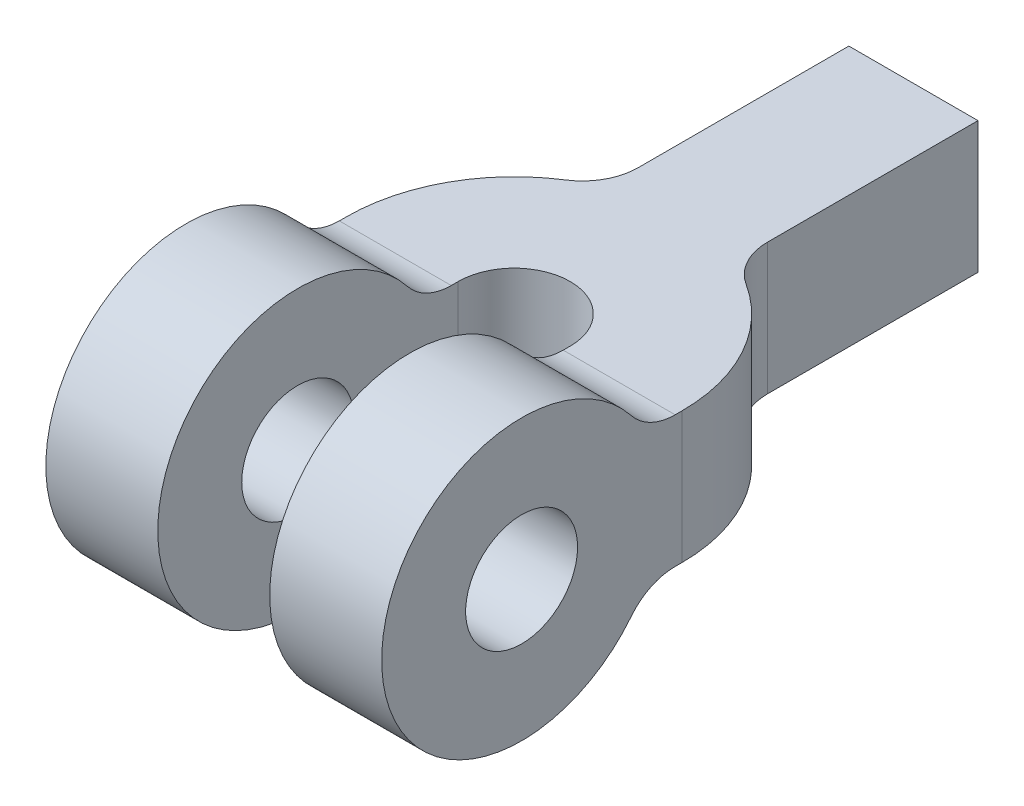
ISO-10303-21;
HEADER;
FILE_DESCRIPTION(('STEP AP214'),'2;1');
FILE_NAME('part.step','',(''),(''),'','','');
FILE_SCHEMA(('AUTOMOTIVE_DESIGN { 1 0 10303 214 1 1 1 1 }'));
ENDSEC;
DATA;
#1=APPLICATION_CONTEXT('core data for automotive mechanical design processes');
#2=APPLICATION_PROTOCOL_DEFINITION('international standard','automotive_design',2000,#1);
#3=PRODUCT_CONTEXT('',#1,'mechanical');
#4=PRODUCT('Part','Part','',(#3));
#5=PRODUCT_RELATED_PRODUCT_CATEGORY('part','',(#4));
#6=PRODUCT_DEFINITION_FORMATION('','',#4);
#7=PRODUCT_DEFINITION_CONTEXT('part definition',#1,'design');
#8=PRODUCT_DEFINITION('design','',#6,#7);
#9=PRODUCT_DEFINITION_SHAPE('','',#8);
#10=(LENGTH_UNIT() NAMED_UNIT(*) SI_UNIT(.MILLI.,.METRE.));
#11=(NAMED_UNIT(*) PLANE_ANGLE_UNIT() SI_UNIT($,.RADIAN.));
#12=(NAMED_UNIT(*) SI_UNIT($,.STERADIAN.) SOLID_ANGLE_UNIT());
#13=UNCERTAINTY_MEASURE_WITH_UNIT(LENGTH_MEASURE(1.E-05),#10,'distance_accuracy_value','');
#14=(GEOMETRIC_REPRESENTATION_CONTEXT(3) GLOBAL_UNCERTAINTY_ASSIGNED_CONTEXT((#13)) GLOBAL_UNIT_ASSIGNED_CONTEXT((#10,
#11,#12)) REPRESENTATION_CONTEXT('',''));
#15=CARTESIAN_POINT('',(0.,0.,0.));
#16=DIRECTION('',(0.,0.,1.));
#17=DIRECTION('',(1.,0.,0.));
#18=AXIS2_PLACEMENT_3D('',#15,#16,#17);
#19=CARTESIAN_POINT('',(-60.,100.,125.));
#20=DIRECTION('',(1.,0.,0.));
#21=DIRECTION('',(0.,0.,-1.));
#22=AXIS2_PLACEMENT_3D('',#19,#20,#21);
#23=PLANE('',#22);
#24=CARTESIAN_POINT('',(-60.,50.,75.));
#25=DIRECTION('',(1.,0.,0.));
#26=DIRECTION('',(0.,0.,-1.));
#27=AXIS2_PLACEMENT_3D('',#24,#25,#26);
#28=CIRCLE('',#27,20.);
#29=CARTESIAN_POINT('',(-60.,50.,55.));
#30=VERTEX_POINT('',#29);
#31=EDGE_CURVE('E289',#30,#30,#28,.T.);
#32=ORIENTED_EDGE('',*,*,#31,.T.);
#33=EDGE_LOOP('',(#32));
#34=FACE_BOUND('',#33,.T.);
#35=DIRECTION('',(0.,0.,-1.));
#36=VECTOR('',#35,1.);
#37=CARTESIAN_POINT('',(-60.,26.5250202616506,0.));
#38=LINE('',#37,#36);
#39=CARTESIAN_POINT('',(-60.,26.5250202616506,20.1372062618926));
#40=VERTEX_POINT('',#39);
#41=CARTESIAN_POINT('',(-60.,26.5250202616506,17.6446099189697));
#42=VERTEX_POINT('',#41);
#43=EDGE_CURVE('E193',#40,#42,#38,.T.);
#44=ORIENTED_EDGE('',*,*,#43,.F.);
#45=CARTESIAN_POINT('',(-60.,6.52502026165062,20.1372062618926));
#46=DIRECTION('',(1.,0.,0.));
#47=DIRECTION('',(0.,0.,-1.));
#48=AXIS2_PLACEMENT_3D('',#45,#46,#47);
#49=CIRCLE('',#48,20.);
#50=CARTESIAN_POINT('',(-60.,18.9464430440362,35.8122901870662));
#51=VERTEX_POINT('',#50);
#52=EDGE_CURVE('E203',#40,#51,#49,.T.);
#53=ORIENTED_EDGE('',*,*,#52,.T.);
#54=CARTESIAN_POINT('',(-60.,50.,75.));
#55=DIRECTION('',(1.,0.,0.));
#56=DIRECTION('',(0.,0.,-1.));
#57=AXIS2_PLACEMENT_3D('',#54,#55,#56);
#58=CIRCLE('',#57,50.);
#59=CARTESIAN_POINT('',(-60.,81.0535569559638,35.8122901870662));
#60=VERTEX_POINT('',#59);
#61=EDGE_CURVE('E299',#60,#51,#58,.T.);
#62=ORIENTED_EDGE('',*,*,#61,.F.);
#63=CARTESIAN_POINT('',(-60.,93.4749797383494,20.1372062618926));
#64=DIRECTION('',(1.,0.,0.));
#65=DIRECTION('',(0.,0.,-1.));
#66=AXIS2_PLACEMENT_3D('',#63,#64,#65);
#67=CIRCLE('',#66,20.);
#68=CARTESIAN_POINT('',(-60.,73.4749797383494,20.1372062618926));
#69=VERTEX_POINT('',#68);
#70=EDGE_CURVE('E226',#69,#60,#67,.F.);
#71=ORIENTED_EDGE('',*,*,#70,.F.);
#72=DIRECTION('',(0.,0.,-1.));
#73=VECTOR('',#72,1.);
#74=CARTESIAN_POINT('',(-60.,73.4749797383494,0.));
#75=LINE('',#74,#73);
#76=CARTESIAN_POINT('',(-60.,73.4749797383494,17.6446099189697));
#77=VERTEX_POINT('',#76);
#78=EDGE_CURVE('E229',#69,#77,#75,.T.);
#79=ORIENTED_EDGE('',*,*,#78,.T.);
#80=DIRECTION('',(0.,1.,0.));
#81=VECTOR('',#80,1.);
#82=CARTESIAN_POINT('',(-60.,0.,17.6446099189697));
#83=LINE('',#82,#81);
#84=EDGE_CURVE('E212',#42,#77,#83,.T.);
#85=ORIENTED_EDGE('',*,*,#84,.F.);
#86=EDGE_LOOP('',(#44,#53,#62,#71,#79,#85));
#87=FACE_BOUND('',#86,.T.);
#88=ADVANCED_FACE('F65',(#34,#87),#23,.F.);
#89=CARTESIAN_POINT('',(60.,100.,125.));
#90=DIRECTION('',(-1.,0.,0.));
#91=DIRECTION('',(0.,0.,1.));
#92=AXIS2_PLACEMENT_3D('',#89,#90,#91);
#93=PLANE('',#92);
#94=CARTESIAN_POINT('',(60.,50.,75.));
#95=DIRECTION('',(1.,0.,0.));
#96=DIRECTION('',(0.,0.,-1.));
#97=AXIS2_PLACEMENT_3D('',#94,#95,#96);
#98=CIRCLE('',#97,20.);
#99=CARTESIAN_POINT('',(60.,50.,55.));
#100=VERTEX_POINT('',#99);
#101=EDGE_CURVE('E288',#100,#100,#98,.T.);
#102=ORIENTED_EDGE('',*,*,#101,.F.);
#103=EDGE_LOOP('',(#102));
#104=FACE_BOUND('',#103,.T.);
#105=DIRECTION('',(0.,0.,-1.));
#106=VECTOR('',#105,1.);
#107=CARTESIAN_POINT('',(60.,26.5250202616506,0.));
#108=LINE('',#107,#106);
#109=CARTESIAN_POINT('',(60.,26.5250202616506,20.1372062618926));
#110=VERTEX_POINT('',#109);
#111=CARTESIAN_POINT('',(60.,26.5250202616506,17.6446099189697));
#112=VERTEX_POINT('',#111);
#113=EDGE_CURVE('E216',#110,#112,#108,.T.);
#114=ORIENTED_EDGE('',*,*,#113,.T.);
#115=DIRECTION('',(0.,1.,0.));
#116=VECTOR('',#115,1.);
#117=CARTESIAN_POINT('',(60.,0.,17.6446099189697));
#118=LINE('',#117,#116);
#119=CARTESIAN_POINT('',(60.,73.4749797383494,17.6446099189697));
#120=VERTEX_POINT('',#119);
#121=EDGE_CURVE('E317',#112,#120,#118,.T.);
#122=ORIENTED_EDGE('',*,*,#121,.T.);
#123=DIRECTION('',(0.,0.,-1.));
#124=VECTOR('',#123,1.);
#125=CARTESIAN_POINT('',(60.,73.4749797383494,0.));
#126=LINE('',#125,#124);
#127=CARTESIAN_POINT('',(60.,73.4749797383494,20.1372062618926));
#128=VERTEX_POINT('',#127);
#129=EDGE_CURVE('E230',#128,#120,#126,.T.);
#130=ORIENTED_EDGE('',*,*,#129,.F.);
#131=CARTESIAN_POINT('',(60.,93.4749797383494,20.1372062618926));
#132=DIRECTION('',(1.,0.,0.));
#133=DIRECTION('',(0.,0.,-1.));
#134=AXIS2_PLACEMENT_3D('',#131,#132,#133);
#135=CIRCLE('',#134,20.);
#136=CARTESIAN_POINT('',(60.,81.0535569559638,35.8122901870662));
#137=VERTEX_POINT('',#136);
#138=EDGE_CURVE('E233',#128,#137,#135,.F.);
#139=ORIENTED_EDGE('',*,*,#138,.T.);
#140=CARTESIAN_POINT('',(60.,50.,75.));
#141=DIRECTION('',(1.,0.,0.));
#142=DIRECTION('',(0.,0.,-1.));
#143=AXIS2_PLACEMENT_3D('',#140,#141,#142);
#144=CIRCLE('',#143,50.);
#145=CARTESIAN_POINT('',(60.,18.9464430440362,35.8122901870662));
#146=VERTEX_POINT('',#145);
#147=EDGE_CURVE('E298',#137,#146,#144,.T.);
#148=ORIENTED_EDGE('',*,*,#147,.T.);
#149=CARTESIAN_POINT('',(60.,6.52502026165062,20.1372062618926));
#150=DIRECTION('',(1.,0.,0.));
#151=DIRECTION('',(0.,0.,-1.));
#152=AXIS2_PLACEMENT_3D('',#149,#150,#151);
#153=CIRCLE('',#152,20.);
#154=EDGE_CURVE('E213',#110,#146,#153,.T.);
#155=ORIENTED_EDGE('',*,*,#154,.F.);
#156=EDGE_LOOP('',(#114,#122,#130,#139,#148,#155));
#157=FACE_BOUND('',#156,.T.);
#158=ADVANCED_FACE('F364',(#104,#157),#93,.F.);
#159=CARTESIAN_POINT('',(20.,0.,0.));
#160=DIRECTION('',(-1.,0.,0.));
#161=DIRECTION('',(0.,0.,1.));
#162=AXIS2_PLACEMENT_3D('',#159,#160,#161);
#163=PLANE('',#162);
#164=CARTESIAN_POINT('',(20.,50.,75.));
#165=DIRECTION('',(-1.,0.,0.));
#166=DIRECTION('',(0.,0.,1.));
#167=AXIS2_PLACEMENT_3D('',#164,#165,#166);
#168=CIRCLE('',#167,20.);
#169=CARTESIAN_POINT('',(20.,50.,95.));
#170=VERTEX_POINT('',#169);
#171=EDGE_CURVE('E295',#170,#170,#168,.T.);
#172=ORIENTED_EDGE('',*,*,#171,.F.);
#173=EDGE_LOOP('',(#172));
#174=FACE_BOUND('',#173,.T.);
#175=DIRECTION('',(0.,1.,0.));
#176=VECTOR('',#175,1.);
#177=CARTESIAN_POINT('',(20.,0.,17.6446099189697));
#178=LINE('',#177,#176);
#179=CARTESIAN_POINT('',(20.,26.5250202616506,17.6446099189697));
#180=VERTEX_POINT('',#179);
#181=CARTESIAN_POINT('',(20.,73.4749797383494,17.6446099189697));
#182=VERTEX_POINT('',#181);
#183=EDGE_CURVE('E326',#180,#182,#178,.T.);
#184=ORIENTED_EDGE('',*,*,#183,.F.);
#185=DIRECTION('',(0.,0.,1.));
#186=VECTOR('',#185,1.);
#187=CARTESIAN_POINT('',(20.,26.5250202616506,0.));
#188=LINE('',#187,#186);
#189=CARTESIAN_POINT('',(20.,26.5250202616506,20.1372062618926));
#190=VERTEX_POINT('',#189);
#191=EDGE_CURVE('E280',#180,#190,#188,.T.);
#192=ORIENTED_EDGE('',*,*,#191,.T.);
#193=CARTESIAN_POINT('',(20.,6.52502026165062,20.1372062618926));
#194=DIRECTION('',(-1.,0.,0.));
#195=DIRECTION('',(0.,0.,1.));
#196=AXIS2_PLACEMENT_3D('',#193,#194,#195);
#197=CIRCLE('',#196,20.);
#198=CARTESIAN_POINT('',(20.,18.9464430440362,35.8122901870662));
#199=VERTEX_POINT('',#198);
#200=EDGE_CURVE('E286',#199,#190,#197,.T.);
#201=ORIENTED_EDGE('',*,*,#200,.F.);
#202=CARTESIAN_POINT('',(20.,50.,75.));
#203=DIRECTION('',(-1.,0.,0.));
#204=DIRECTION('',(0.,0.,1.));
#205=AXIS2_PLACEMENT_3D('',#202,#203,#204);
#206=CIRCLE('',#205,50.);
#207=CARTESIAN_POINT('',(20.,81.0535569559638,35.8122901870662));
#208=VERTEX_POINT('',#207);
#209=EDGE_CURVE('E79',#199,#208,#206,.T.);
#210=ORIENTED_EDGE('',*,*,#209,.T.);
#211=CARTESIAN_POINT('',(20.,93.4749797383494,20.1372062618926));
#212=DIRECTION('',(-1.,0.,0.));
#213=DIRECTION('',(0.,0.,1.));
#214=AXIS2_PLACEMENT_3D('',#211,#212,#213);
#215=CIRCLE('',#214,20.);
#216=CARTESIAN_POINT('',(20.,73.4749797383494,20.1372062618926));
#217=VERTEX_POINT('',#216);
#218=EDGE_CURVE('E283',#208,#217,#215,.F.);
#219=ORIENTED_EDGE('',*,*,#218,.T.);
#220=DIRECTION('',(0.,0.,1.));
#221=VECTOR('',#220,1.);
#222=CARTESIAN_POINT('',(20.,73.4749797383494,0.));
#223=LINE('',#222,#221);
#224=EDGE_CURVE('E263',#182,#217,#223,.T.);
#225=ORIENTED_EDGE('',*,*,#224,.F.);
#226=EDGE_LOOP('',(#184,#192,#201,#210,#219,#225));
#227=FACE_BOUND('',#226,.T.);
#228=ADVANCED_FACE('F354',(#174,#227),#163,.T.);
#229=CARTESIAN_POINT('',(-20.,0.,0.));
#230=DIRECTION('',(-1.,0.,0.));
#231=DIRECTION('',(0.,0.,1.));
#232=AXIS2_PLACEMENT_3D('',#229,#230,#231);
#233=PLANE('',#232);
#234=CARTESIAN_POINT('',(-20.,50.,75.));
#235=DIRECTION('',(-1.,0.,0.));
#236=DIRECTION('',(0.,0.,1.));
#237=AXIS2_PLACEMENT_3D('',#234,#235,#236);
#238=CIRCLE('',#237,20.);
#239=CARTESIAN_POINT('',(-20.,50.,95.));
#240=VERTEX_POINT('',#239);
#241=EDGE_CURVE('E292',#240,#240,#238,.T.);
#242=ORIENTED_EDGE('',*,*,#241,.T.);
#243=EDGE_LOOP('',(#242));
#244=FACE_BOUND('',#243,.T.);
#245=DIRECTION('',(0.,0.,1.));
#246=VECTOR('',#245,1.);
#247=CARTESIAN_POINT('',(-20.,26.5250202616506,0.));
#248=LINE('',#247,#246);
#249=CARTESIAN_POINT('',(-20.,26.5250202616506,17.6446099189697));
#250=VERTEX_POINT('',#249);
#251=CARTESIAN_POINT('',(-20.,26.5250202616506,20.1372062618926));
#252=VERTEX_POINT('',#251);
#253=EDGE_CURVE('E196',#250,#252,#248,.T.);
#254=ORIENTED_EDGE('',*,*,#253,.F.);
#255=DIRECTION('',(0.,1.,0.));
#256=VECTOR('',#255,1.);
#257=CARTESIAN_POINT('',(-20.,0.,17.6446099189697));
#258=LINE('',#257,#256);
#259=CARTESIAN_POINT('',(-20.,73.4749797383494,17.6446099189697));
#260=VERTEX_POINT('',#259);
#261=EDGE_CURVE('E303',#250,#260,#258,.T.);
#262=ORIENTED_EDGE('',*,*,#261,.T.);
#263=DIRECTION('',(0.,0.,1.));
#264=VECTOR('',#263,1.);
#265=CARTESIAN_POINT('',(-20.,73.4749797383494,0.));
#266=LINE('',#265,#264);
#267=CARTESIAN_POINT('',(-20.,73.4749797383494,20.1372062618926));
#268=VERTEX_POINT('',#267);
#269=EDGE_CURVE('E260',#260,#268,#266,.T.);
#270=ORIENTED_EDGE('',*,*,#269,.T.);
#271=CARTESIAN_POINT('',(-20.,93.4749797383494,20.1372062618926));
#272=DIRECTION('',(-1.,0.,0.));
#273=DIRECTION('',(0.,0.,1.));
#274=AXIS2_PLACEMENT_3D('',#271,#272,#273);
#275=CIRCLE('',#274,20.);
#276=CARTESIAN_POINT('',(-20.,81.0535569559638,35.8122901870662));
#277=VERTEX_POINT('',#276);
#278=EDGE_CURVE('E72',#277,#268,#275,.F.);
#279=ORIENTED_EDGE('',*,*,#278,.F.);
#280=CARTESIAN_POINT('',(-20.,50.,75.));
#281=DIRECTION('',(-1.,0.,0.));
#282=DIRECTION('',(0.,0.,1.));
#283=AXIS2_PLACEMENT_3D('',#280,#281,#282);
#284=CIRCLE('',#283,50.);
#285=CARTESIAN_POINT('',(-20.,18.9464430440362,35.8122901870662));
#286=VERTEX_POINT('',#285);
#287=EDGE_CURVE('E86',#286,#277,#284,.T.);
#288=ORIENTED_EDGE('',*,*,#287,.F.);
#289=CARTESIAN_POINT('',(-20.,6.52502026165062,20.1372062618926));
#290=DIRECTION('',(-1.,0.,0.));
#291=DIRECTION('',(0.,0.,1.));
#292=AXIS2_PLACEMENT_3D('',#289,#290,#291);
#293=CIRCLE('',#292,20.);
#294=EDGE_CURVE('E12',#286,#252,#293,.T.);
#295=ORIENTED_EDGE('',*,*,#294,.T.);
#296=EDGE_LOOP('',(#254,#262,#270,#279,#288,#295));
#297=FACE_BOUND('',#296,.T.);
#298=ADVANCED_FACE('F345',(#244,#297),#233,.F.);
#299=CARTESIAN_POINT('',(60.,100.,-125.));
#300=DIRECTION('',(0.,0.,1.));
#301=DIRECTION('',(1.,0.,0.));
#302=AXIS2_PLACEMENT_3D('',#299,#300,#301);
#303=PLANE('',#302);
#304=DIRECTION('',(1.,0.,0.));
#305=VECTOR('',#304,1.);
#306=CARTESIAN_POINT('',(-60.,26.5250202616506,-125.));
#307=LINE('',#306,#305);
#308=CARTESIAN_POINT('',(-23.0717096546584,26.5250202616506,-125.));
#309=VERTEX_POINT('',#308);
#310=CARTESIAN_POINT('',(23.0717096546584,26.5250202616506,-125.));
#311=VERTEX_POINT('',#310);
#312=EDGE_CURVE('E222',#309,#311,#307,.T.);
#313=ORIENTED_EDGE('',*,*,#312,.F.);
#314=DIRECTION('',(0.,1.,0.));
#315=VECTOR('',#314,1.);
#316=CARTESIAN_POINT('',(-23.0717096546584,0.,-125.));
#317=LINE('',#316,#315);
#318=CARTESIAN_POINT('',(-23.0717096546584,73.4749797383494,-125.));
#319=VERTEX_POINT('',#318);
#320=EDGE_CURVE('E305',#309,#319,#317,.T.);
#321=ORIENTED_EDGE('',*,*,#320,.T.);
#322=DIRECTION('',(1.,0.,0.));
#323=VECTOR('',#322,1.);
#324=CARTESIAN_POINT('',(-60.,73.4749797383494,-125.));
#325=LINE('',#324,#323);
#326=CARTESIAN_POINT('',(23.0717096546584,73.4749797383494,-125.));
#327=VERTEX_POINT('',#326);
#328=EDGE_CURVE('E240',#319,#327,#325,.T.);
#329=ORIENTED_EDGE('',*,*,#328,.T.);
#330=DIRECTION('',(0.,1.,0.));
#331=VECTOR('',#330,1.);
#332=CARTESIAN_POINT('',(23.0717096546584,0.,-125.));
#333=LINE('',#332,#331);
#334=EDGE_CURVE('E314',#311,#327,#333,.T.);
#335=ORIENTED_EDGE('',*,*,#334,.F.);
#336=EDGE_LOOP('',(#313,#321,#329,#335));
#337=FACE_BOUND('',#336,.T.);
#338=ADVANCED_FACE('F381',(#337),#303,.F.);
#339=CARTESIAN_POINT('',(0.,0.,17.6446099189697));
#340=DIRECTION('',(0.,1.,0.));
#341=DIRECTION('',(0.,0.,1.));
#342=AXIS2_PLACEMENT_3D('',#339,#340,#341);
#343=CYLINDRICAL_SURFACE('',#342,20.);
#344=CARTESIAN_POINT('',(0.,26.5250202616506,17.6446099189697));
#345=DIRECTION('',(0.,-1.,0.));
#346=DIRECTION('',(0.,0.,-1.));
#347=AXIS2_PLACEMENT_3D('',#344,#345,#346);
#348=CIRCLE('',#347,20.);
#349=EDGE_CURVE('E277',#180,#250,#348,.F.);
#350=ORIENTED_EDGE('',*,*,#349,.F.);
#351=ORIENTED_EDGE('',*,*,#183,.T.);
#352=CARTESIAN_POINT('',(0.,73.4749797383494,17.6446099189697));
#353=DIRECTION('',(0.,-1.,0.));
#354=DIRECTION('',(0.,0.,-1.));
#355=AXIS2_PLACEMENT_3D('',#352,#353,#354);
#356=CIRCLE('',#355,20.);
#357=EDGE_CURVE('E257',#182,#260,#356,.F.);
#358=ORIENTED_EDGE('',*,*,#357,.T.);
#359=ORIENTED_EDGE('',*,*,#261,.F.);
#360=EDGE_LOOP('',(#350,#351,#358,#359));
#361=FACE_BOUND('',#360,.T.);
#362=ADVANCED_FACE('F349',(#361),#343,.F.);
#363=CARTESIAN_POINT('',(23.0717096546585,0.,0.));
#364=DIRECTION('',(-1.,0.,0.));
#365=DIRECTION('',(0.,0.,1.));
#366=AXIS2_PLACEMENT_3D('',#363,#364,#365);
#367=PLANE('',#366);
#368=DIRECTION('',(0.,0.,1.));
#369=VECTOR('',#368,1.);
#370=CARTESIAN_POINT('',(23.0717096546585,26.5250202616506,0.));
#371=LINE('',#370,#369);
#372=CARTESIAN_POINT('',(23.0717096546585,26.5250202616506,-49.7707283018298));
#373=VERTEX_POINT('',#372);
#374=EDGE_CURVE('E275',#311,#373,#371,.T.);
#375=ORIENTED_EDGE('',*,*,#374,.F.);
#376=ORIENTED_EDGE('',*,*,#334,.T.);
#377=DIRECTION('',(0.,0.,1.));
#378=VECTOR('',#377,1.);
#379=CARTESIAN_POINT('',(23.0717096546585,73.4749797383494,0.));
#380=LINE('',#379,#378);
#381=CARTESIAN_POINT('',(23.0717096546585,73.4749797383494,-49.7707283018298));
#382=VERTEX_POINT('',#381);
#383=EDGE_CURVE('E254',#327,#382,#380,.T.);
#384=ORIENTED_EDGE('',*,*,#383,.T.);
#385=DIRECTION('',(0.,1.,0.));
#386=VECTOR('',#385,1.);
#387=CARTESIAN_POINT('',(23.0717096546585,0.,-49.7707283018298));
#388=LINE('',#387,#386);
#389=EDGE_CURVE('E323',#373,#382,#388,.T.);
#390=ORIENTED_EDGE('',*,*,#389,.F.);
#391=EDGE_LOOP('',(#375,#376,#384,#390));
#392=FACE_BOUND('',#391,.T.);
#393=ADVANCED_FACE('F377',(#392),#367,.F.);
#394=CARTESIAN_POINT('',(0.,0.,17.6446099189697));
#395=DIRECTION('',(0.,1.,0.));
#396=DIRECTION('',(0.,0.,1.));
#397=AXIS2_PLACEMENT_3D('',#394,#395,#396);
#398=CYLINDRICAL_SURFACE('',#397,60.);
#399=ORIENTED_EDGE('',*,*,#121,.F.);
#400=CARTESIAN_POINT('',(0.,26.5250202616506,17.6446099189697));
#401=DIRECTION('',(0.,-1.,0.));
#402=DIRECTION('',(0.,0.,-1.));
#403=AXIS2_PLACEMENT_3D('',#400,#401,#402);
#404=CIRCLE('',#403,60.);
#405=CARTESIAN_POINT('',(32.3037822409938,26.5250202616506,-32.9168937466299));
#406=VERTEX_POINT('',#405);
#407=EDGE_CURVE('E272',#112,#406,#404,.F.);
#408=ORIENTED_EDGE('',*,*,#407,.T.);
#409=DIRECTION('',(0.,1.,0.));
#410=VECTOR('',#409,1.);
#411=CARTESIAN_POINT('',(32.3037822409938,0.,-32.9168937466299));
#412=LINE('',#411,#410);
#413=CARTESIAN_POINT('',(32.3037822409938,73.4749797383494,-32.9168937466299));
#414=VERTEX_POINT('',#413);
#415=EDGE_CURVE('E320',#406,#414,#412,.T.);
#416=ORIENTED_EDGE('',*,*,#415,.T.);
#417=CARTESIAN_POINT('',(0.,73.4749797383494,17.6446099189697));
#418=DIRECTION('',(0.,-1.,0.));
#419=DIRECTION('',(0.,0.,-1.));
#420=AXIS2_PLACEMENT_3D('',#417,#418,#419);
#421=CIRCLE('',#420,60.);
#422=EDGE_CURVE('E252',#120,#414,#421,.F.);
#423=ORIENTED_EDGE('',*,*,#422,.F.);
#424=EDGE_LOOP('',(#399,#408,#416,#423));
#425=FACE_BOUND('',#424,.T.);
#426=ADVANCED_FACE('F369',(#425),#398,.T.);
#427=CARTESIAN_POINT('',(43.0717096546584,0.,-49.7707283018298));
#428=DIRECTION('',(0.,1.,0.));
#429=DIRECTION('',(0.,0.,1.));
#430=AXIS2_PLACEMENT_3D('',#427,#428,#429);
#431=CYLINDRICAL_SURFACE('',#430,20.);
#432=CARTESIAN_POINT('',(43.0717096546584,26.5250202616506,-49.7707283018298));
#433=DIRECTION('',(0.,-1.,0.));
#434=DIRECTION('',(0.,0.,-1.));
#435=AXIS2_PLACEMENT_3D('',#432,#433,#434);
#436=CIRCLE('',#435,20.);
#437=EDGE_CURVE('E270',#373,#406,#436,.F.);
#438=ORIENTED_EDGE('',*,*,#437,.F.);
#439=ORIENTED_EDGE('',*,*,#389,.T.);
#440=CARTESIAN_POINT('',(43.0717096546584,73.4749797383494,-49.7707283018298));
#441=DIRECTION('',(0.,-1.,0.));
#442=DIRECTION('',(0.,0.,-1.));
#443=AXIS2_PLACEMENT_3D('',#440,#441,#442);
#444=CIRCLE('',#443,20.);
#445=EDGE_CURVE('E249',#382,#414,#444,.F.);
#446=ORIENTED_EDGE('',*,*,#445,.T.);
#447=ORIENTED_EDGE('',*,*,#415,.F.);
#448=EDGE_LOOP('',(#438,#439,#446,#447));
#449=FACE_BOUND('',#448,.T.);
#450=ADVANCED_FACE('F373',(#449),#431,.F.);
#451=CARTESIAN_POINT('',(0.,0.,17.6446099189697));
#452=DIRECTION('',(0.,1.,0.));
#453=DIRECTION('',(0.,0.,1.));
#454=AXIS2_PLACEMENT_3D('',#451,#452,#453);
#455=CYLINDRICAL_SURFACE('',#454,60.);
#456=DIRECTION('',(0.,1.,0.));
#457=VECTOR('',#456,1.);
#458=CARTESIAN_POINT('',(-32.3037822409938,0.,-32.9168937466299));
#459=LINE('',#458,#457);
#460=CARTESIAN_POINT('',(-32.3037822409938,26.5250202616506,-32.9168937466299));
#461=VERTEX_POINT('',#460);
#462=CARTESIAN_POINT('',(-32.3037822409938,73.4749797383494,-32.9168937466299));
#463=VERTEX_POINT('',#462);
#464=EDGE_CURVE('E311',#461,#463,#459,.T.);
#465=ORIENTED_EDGE('',*,*,#464,.F.);
#466=CARTESIAN_POINT('',(0.,26.5250202616506,17.6446099189697));
#467=DIRECTION('',(0.,-1.,0.));
#468=DIRECTION('',(0.,0.,-1.));
#469=AXIS2_PLACEMENT_3D('',#466,#467,#468);
#470=CIRCLE('',#469,60.);
#471=EDGE_CURVE('E268',#461,#42,#470,.F.);
#472=ORIENTED_EDGE('',*,*,#471,.T.);
#473=ORIENTED_EDGE('',*,*,#84,.T.);
#474=CARTESIAN_POINT('',(0.,73.4749797383494,17.6446099189697));
#475=DIRECTION('',(0.,-1.,0.));
#476=DIRECTION('',(0.,0.,-1.));
#477=AXIS2_PLACEMENT_3D('',#474,#475,#476);
#478=CIRCLE('',#477,60.);
#479=EDGE_CURVE('E247',#463,#77,#478,.F.);
#480=ORIENTED_EDGE('',*,*,#479,.F.);
#481=EDGE_LOOP('',(#465,#472,#473,#480));
#482=FACE_BOUND('',#481,.T.);
#483=ADVANCED_FACE('F393',(#482),#455,.T.);
#484=CARTESIAN_POINT('',(-23.0717096546584,0.,0.));
#485=DIRECTION('',(-1.,0.,0.));
#486=DIRECTION('',(0.,0.,1.));
#487=AXIS2_PLACEMENT_3D('',#484,#485,#486);
#488=PLANE('',#487);
#489=ORIENTED_EDGE('',*,*,#320,.F.);
#490=DIRECTION('',(0.,0.,1.));
#491=VECTOR('',#490,1.);
#492=CARTESIAN_POINT('',(-23.0717096546584,26.5250202616506,0.));
#493=LINE('',#492,#491);
#494=CARTESIAN_POINT('',(-23.0717096546584,26.5250202616506,-49.7707283018298));
#495=VERTEX_POINT('',#494);
#496=EDGE_CURVE('E265',#309,#495,#493,.T.);
#497=ORIENTED_EDGE('',*,*,#496,.T.);
#498=DIRECTION('',(0.,1.,0.));
#499=VECTOR('',#498,1.);
#500=CARTESIAN_POINT('',(-23.0717096546584,0.,-49.7707283018298));
#501=LINE('',#500,#499);
#502=CARTESIAN_POINT('',(-23.0717096546584,73.4749797383494,-49.7707283018298));
#503=VERTEX_POINT('',#502);
#504=EDGE_CURVE('E308',#495,#503,#501,.T.);
#505=ORIENTED_EDGE('',*,*,#504,.T.);
#506=DIRECTION('',(0.,0.,1.));
#507=VECTOR('',#506,1.);
#508=CARTESIAN_POINT('',(-23.0717096546584,73.4749797383494,0.));
#509=LINE('',#508,#507);
#510=EDGE_CURVE('E224',#319,#503,#509,.T.);
#511=ORIENTED_EDGE('',*,*,#510,.F.);
#512=EDGE_LOOP('',(#489,#497,#505,#511));
#513=FACE_BOUND('',#512,.T.);
#514=ADVANCED_FACE('F385',(#513),#488,.T.);
#515=CARTESIAN_POINT('',(-43.0717096546584,0.,-49.7707283018298));
#516=DIRECTION('',(0.,1.,0.));
#517=DIRECTION('',(0.,0.,1.));
#518=AXIS2_PLACEMENT_3D('',#515,#516,#517);
#519=CYLINDRICAL_SURFACE('',#518,20.);
#520=CARTESIAN_POINT('',(-43.0717096546584,26.5250202616506,-49.7707283018298));
#521=DIRECTION('',(0.,-1.,0.));
#522=DIRECTION('',(0.,0.,-1.));
#523=AXIS2_PLACEMENT_3D('',#520,#521,#522);
#524=CIRCLE('',#523,20.);
#525=EDGE_CURVE('E337',#461,#495,#524,.F.);
#526=ORIENTED_EDGE('',*,*,#525,.F.);
#527=ORIENTED_EDGE('',*,*,#464,.T.);
#528=CARTESIAN_POINT('',(-43.0717096546584,73.4749797383494,-49.7707283018298));
#529=DIRECTION('',(0.,-1.,0.));
#530=DIRECTION('',(0.,0.,-1.));
#531=AXIS2_PLACEMENT_3D('',#528,#529,#530);
#532=CIRCLE('',#531,20.);
#533=EDGE_CURVE('E332',#463,#503,#532,.F.);
#534=ORIENTED_EDGE('',*,*,#533,.T.);
#535=ORIENTED_EDGE('',*,*,#504,.F.);
#536=EDGE_LOOP('',(#526,#527,#534,#535));
#537=FACE_BOUND('',#536,.T.);
#538=ADVANCED_FACE('F389',(#537),#519,.F.);
#539=CARTESIAN_POINT('',(-60.,50.,75.));
#540=DIRECTION('',(1.,0.,0.));
#541=DIRECTION('',(0.,0.,-1.));
#542=AXIS2_PLACEMENT_3D('',#539,#540,#541);
#543=CYLINDRICAL_SURFACE('',#542,50.);
#544=ORIENTED_EDGE('',*,*,#287,.T.);
#545=DIRECTION('',(1.,0.,0.));
#546=VECTOR('',#545,1.);
#547=CARTESIAN_POINT('',(-60.,81.0535569559638,35.8122901870662));
#548=LINE('',#547,#546);
#549=EDGE_CURVE('E220',#60,#277,#548,.T.);
#550=ORIENTED_EDGE('',*,*,#549,.F.);
#551=ORIENTED_EDGE('',*,*,#61,.T.);
#552=DIRECTION('',(1.,0.,0.));
#553=VECTOR('',#552,1.);
#554=CARTESIAN_POINT('',(-60.,18.9464430440362,35.8122901870662));
#555=LINE('',#554,#553);
#556=EDGE_CURVE('E206',#51,#286,#555,.T.);
#557=ORIENTED_EDGE('',*,*,#556,.T.);
#558=EDGE_LOOP('',(#544,#550,#551,#557));
#559=FACE_BOUND('',#558,.T.);
#560=ADVANCED_FACE('F446',(#559),#543,.T.);
#561=ORIENTED_EDGE('',*,*,#209,.F.);
#562=EDGE_CURVE('E198',#199,#146,#555,.T.);
#563=ORIENTED_EDGE('',*,*,#562,.T.);
#564=ORIENTED_EDGE('',*,*,#147,.F.);
#565=EDGE_CURVE('E239',#208,#137,#548,.T.);
#566=ORIENTED_EDGE('',*,*,#565,.F.);
#567=EDGE_LOOP('',(#561,#563,#564,#566));
#568=FACE_BOUND('',#567,.T.);
#569=ADVANCED_FACE('F361',(#568),#543,.T.);
#570=CARTESIAN_POINT('',(-60.,50.,75.));
#571=DIRECTION('',(1.,0.,0.));
#572=DIRECTION('',(0.,0.,-1.));
#573=AXIS2_PLACEMENT_3D('',#570,#571,#572);
#574=CYLINDRICAL_SURFACE('',#573,20.);
#575=ORIENTED_EDGE('',*,*,#31,.F.);
#576=EDGE_LOOP('',(#575));
#577=FACE_BOUND('',#576,.T.);
#578=ORIENTED_EDGE('',*,*,#241,.F.);
#579=EDGE_LOOP('',(#578));
#580=FACE_BOUND('',#579,.T.);
#581=ADVANCED_FACE('F413',(#577,#580),#574,.F.);
#582=ORIENTED_EDGE('',*,*,#171,.T.);
#583=EDGE_LOOP('',(#582));
#584=FACE_BOUND('',#583,.T.);
#585=ORIENTED_EDGE('',*,*,#101,.T.);
#586=EDGE_LOOP('',(#585));
#587=FACE_BOUND('',#586,.T.);
#588=ADVANCED_FACE('F416',(#584,#587),#574,.F.);
#589=CARTESIAN_POINT('',(-60.,93.4749797383494,20.1372062618926));
#590=DIRECTION('',(1.,0.,0.));
#591=DIRECTION('',(0.,0.,-1.));
#592=AXIS2_PLACEMENT_3D('',#589,#590,#591);
#593=CYLINDRICAL_SURFACE('',#592,20.);
#594=ORIENTED_EDGE('',*,*,#278,.T.);
#595=DIRECTION('',(1.,0.,0.));
#596=VECTOR('',#595,1.);
#597=CARTESIAN_POINT('',(-60.,73.4749797383494,20.1372062618926));
#598=LINE('',#597,#596);
#599=EDGE_CURVE('E243',#69,#268,#598,.T.);
#600=ORIENTED_EDGE('',*,*,#599,.F.);
#601=ORIENTED_EDGE('',*,*,#70,.T.);
#602=ORIENTED_EDGE('',*,*,#549,.T.);
#603=EDGE_LOOP('',(#594,#600,#601,#602));
#604=FACE_BOUND('',#603,.T.);
#605=ADVANCED_FACE('F339',(#604),#593,.F.);
#606=CARTESIAN_POINT('',(-60.,73.4749797383494,0.));
#607=DIRECTION('',(0.,-1.,0.));
#608=DIRECTION('',(0.,0.,-1.));
#609=AXIS2_PLACEMENT_3D('',#606,#607,#608);
#610=PLANE('',#609);
#611=ORIENTED_EDGE('',*,*,#224,.T.);
#612=EDGE_CURVE('E232',#217,#128,#598,.T.);
#613=ORIENTED_EDGE('',*,*,#612,.T.);
#614=ORIENTED_EDGE('',*,*,#129,.T.);
#615=ORIENTED_EDGE('',*,*,#422,.T.);
#616=ORIENTED_EDGE('',*,*,#445,.F.);
#617=ORIENTED_EDGE('',*,*,#383,.F.);
#618=ORIENTED_EDGE('',*,*,#328,.F.);
#619=ORIENTED_EDGE('',*,*,#510,.T.);
#620=ORIENTED_EDGE('',*,*,#533,.F.);
#621=ORIENTED_EDGE('',*,*,#479,.T.);
#622=ORIENTED_EDGE('',*,*,#78,.F.);
#623=ORIENTED_EDGE('',*,*,#599,.T.);
#624=ORIENTED_EDGE('',*,*,#269,.F.);
#625=ORIENTED_EDGE('',*,*,#357,.F.);
#626=EDGE_LOOP('',(#611,#613,#614,#615,#616,#617,#618,#619,#620,#621,#622,#623,#624,#625));
#627=FACE_BOUND('',#626,.T.);
#628=ADVANCED_FACE('F343',(#627),#610,.F.);
#629=ORIENTED_EDGE('',*,*,#565,.T.);
#630=ORIENTED_EDGE('',*,*,#138,.F.);
#631=ORIENTED_EDGE('',*,*,#612,.F.);
#632=ORIENTED_EDGE('',*,*,#218,.F.);
#633=EDGE_LOOP('',(#629,#630,#631,#632));
#634=FACE_BOUND('',#633,.T.);
#635=ADVANCED_FACE('F359',(#634),#593,.F.);
#636=CARTESIAN_POINT('',(-60.,6.52502026165062,20.1372062618926));
#637=DIRECTION('',(1.,0.,0.));
#638=DIRECTION('',(0.,0.,-1.));
#639=AXIS2_PLACEMENT_3D('',#636,#637,#638);
#640=CYLINDRICAL_SURFACE('',#639,20.);
#641=ORIENTED_EDGE('',*,*,#556,.F.);
#642=ORIENTED_EDGE('',*,*,#52,.F.);
#643=DIRECTION('',(1.,0.,0.));
#644=VECTOR('',#643,1.);
#645=CARTESIAN_POINT('',(-60.,26.5250202616506,20.1372062618926));
#646=LINE('',#645,#644);
#647=EDGE_CURVE('E189',#40,#252,#646,.T.);
#648=ORIENTED_EDGE('',*,*,#647,.T.);
#649=ORIENTED_EDGE('',*,*,#294,.F.);
#650=EDGE_LOOP('',(#641,#642,#648,#649));
#651=FACE_BOUND('',#650,.T.);
#652=ADVANCED_FACE('F204',(#651),#640,.F.);
#653=CARTESIAN_POINT('',(-60.,26.5250202616506,0.));
#654=DIRECTION('',(0.,-1.,0.));
#655=DIRECTION('',(0.,0.,-1.));
#656=AXIS2_PLACEMENT_3D('',#653,#654,#655);
#657=PLANE('',#656);
#658=ORIENTED_EDGE('',*,*,#349,.T.);
#659=ORIENTED_EDGE('',*,*,#253,.T.);
#660=ORIENTED_EDGE('',*,*,#647,.F.);
#661=ORIENTED_EDGE('',*,*,#43,.T.);
#662=ORIENTED_EDGE('',*,*,#471,.F.);
#663=ORIENTED_EDGE('',*,*,#525,.T.);
#664=ORIENTED_EDGE('',*,*,#496,.F.);
#665=ORIENTED_EDGE('',*,*,#312,.T.);
#666=ORIENTED_EDGE('',*,*,#374,.T.);
#667=ORIENTED_EDGE('',*,*,#437,.T.);
#668=ORIENTED_EDGE('',*,*,#407,.F.);
#669=ORIENTED_EDGE('',*,*,#113,.F.);
#670=EDGE_CURVE('E199',#190,#110,#646,.T.);
#671=ORIENTED_EDGE('',*,*,#670,.F.);
#672=ORIENTED_EDGE('',*,*,#191,.F.);
#673=EDGE_LOOP('',(#658,#659,#660,#661,#662,#663,#664,#665,#666,#667,#668,#669,#671,#672));
#674=FACE_BOUND('',#673,.T.);
#675=ADVANCED_FACE('F191',(#674),#657,.T.);
#676=ORIENTED_EDGE('',*,*,#200,.T.);
#677=ORIENTED_EDGE('',*,*,#670,.T.);
#678=ORIENTED_EDGE('',*,*,#154,.T.);
#679=ORIENTED_EDGE('',*,*,#562,.F.);
#680=EDGE_LOOP('',(#676,#677,#678,#679));
#681=FACE_BOUND('',#680,.T.);
#682=ADVANCED_FACE('F397',(#681),#640,.F.);
#683=CLOSED_SHELL('',(#88,#158,#228,#298,#338,#362,#393,#426,#450,#483,#514,#538,#560,#569,#581,
#588,#605,#628,#635,#652,#675,#682));
#684=MANIFOLD_SOLID_BREP('B2',#683);
#685=ADVANCED_BREP_SHAPE_REPRESENTATION('',(#18,#684),#14);
#686=SHAPE_DEFINITION_REPRESENTATION(#9,#685);
ENDSEC;
END-ISO-10303-21;
